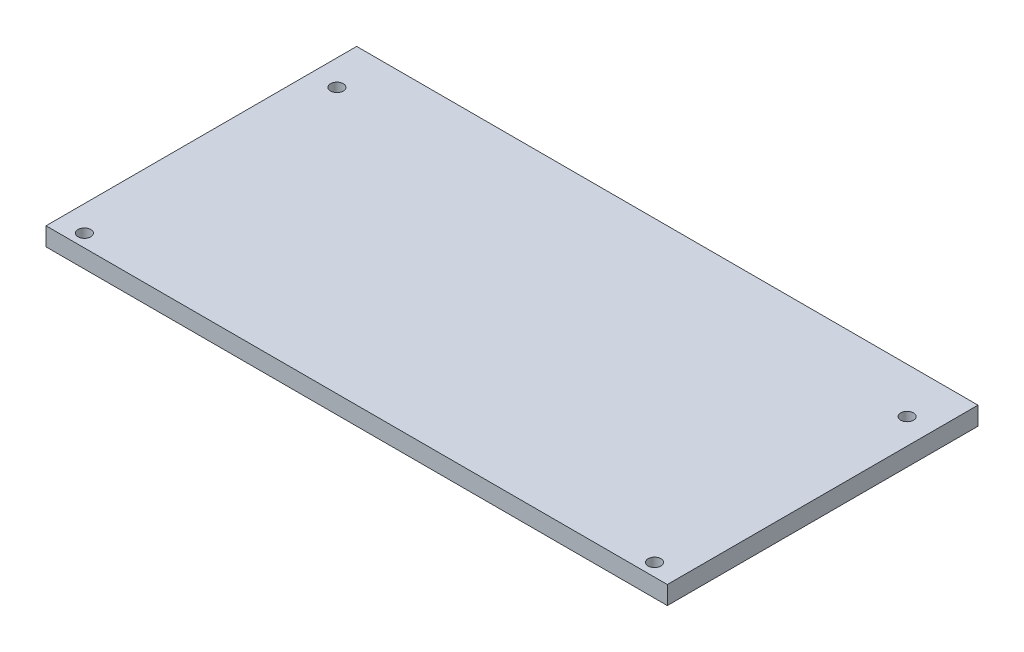
ISO-10303-21;
HEADER;
FILE_DESCRIPTION(('STEP AP214'),'2;1');
FILE_NAME('part.step','',(''),(''),'','','');
FILE_SCHEMA(('AUTOMOTIVE_DESIGN { 1 0 10303 214 1 1 1 1 }'));
ENDSEC;
DATA;
#1=APPLICATION_CONTEXT('core data for automotive mechanical design processes');
#2=APPLICATION_PROTOCOL_DEFINITION('international standard','automotive_design',2000,#1);
#3=PRODUCT_CONTEXT('',#1,'mechanical');
#4=PRODUCT('Part','Part','',(#3));
#5=PRODUCT_RELATED_PRODUCT_CATEGORY('part','',(#4));
#6=PRODUCT_DEFINITION_FORMATION('','',#4);
#7=PRODUCT_DEFINITION_CONTEXT('part definition',#1,'design');
#8=PRODUCT_DEFINITION('design','',#6,#7);
#9=PRODUCT_DEFINITION_SHAPE('','',#8);
#10=(LENGTH_UNIT() NAMED_UNIT(*) SI_UNIT(.MILLI.,.METRE.));
#11=(NAMED_UNIT(*) PLANE_ANGLE_UNIT() SI_UNIT($,.RADIAN.));
#12=(NAMED_UNIT(*) SI_UNIT($,.STERADIAN.) SOLID_ANGLE_UNIT());
#13=UNCERTAINTY_MEASURE_WITH_UNIT(LENGTH_MEASURE(1.E-05),#10,'distance_accuracy_value','');
#14=(GEOMETRIC_REPRESENTATION_CONTEXT(3) GLOBAL_UNCERTAINTY_ASSIGNED_CONTEXT((#13)) GLOBAL_UNIT_ASSIGNED_CONTEXT((#10,
#11,#12)) REPRESENTATION_CONTEXT('',''));
#15=CARTESIAN_POINT('',(0.,0.,0.));
#16=DIRECTION('',(0.,0.,1.));
#17=DIRECTION('',(1.,0.,0.));
#18=AXIS2_PLACEMENT_3D('',#15,#16,#17);
#19=CARTESIAN_POINT('',(-48.0628272251309,5.,-28.7041884816754));
#20=DIRECTION('',(1.,0.,0.));
#21=DIRECTION('',(0.,0.,-1.));
#22=AXIS2_PLACEMENT_3D('',#19,#20,#21);
#23=PLANE('',#22);
#24=DIRECTION('',(0.,0.,1.));
#25=VECTOR('',#24,1.);
#26=CARTESIAN_POINT('',(-48.0628272251309,0.,-28.7041884816754));
#27=LINE('',#26,#25);
#28=CARTESIAN_POINT('',(-48.0628272251309,0.,-28.7041884816754));
#29=VERTEX_POINT('',#28);
#30=CARTESIAN_POINT('',(-48.0628272251309,0.,56.2958115183246));
#31=VERTEX_POINT('',#30);
#32=EDGE_CURVE('E106',#29,#31,#27,.T.);
#33=ORIENTED_EDGE('',*,*,#32,.T.);
#34=DIRECTION('',(0.,-1.,0.));
#35=VECTOR('',#34,1.);
#36=CARTESIAN_POINT('',(-48.0628272251309,5.,56.2958115183246));
#37=LINE('',#36,#35);
#38=CARTESIAN_POINT('',(-48.0628272251309,5.,56.2958115183246));
#39=VERTEX_POINT('',#38);
#40=EDGE_CURVE('E11',#39,#31,#37,.T.);
#41=ORIENTED_EDGE('',*,*,#40,.F.);
#42=DIRECTION('',(0.,0.,1.));
#43=VECTOR('',#42,1.);
#44=CARTESIAN_POINT('',(-48.0628272251309,5.,-28.7041884816754));
#45=LINE('',#44,#43);
#46=CARTESIAN_POINT('',(-48.0628272251309,5.,-28.7041884816754));
#47=VERTEX_POINT('',#46);
#48=EDGE_CURVE('E90',#47,#39,#45,.T.);
#49=ORIENTED_EDGE('',*,*,#48,.F.);
#50=DIRECTION('',(0.,-1.,0.));
#51=VECTOR('',#50,1.);
#52=CARTESIAN_POINT('',(-48.0628272251309,5.,-28.7041884816754));
#53=LINE('',#52,#51);
#54=EDGE_CURVE('E102',#47,#29,#53,.T.);
#55=ORIENTED_EDGE('',*,*,#54,.T.);
#56=EDGE_LOOP('',(#33,#41,#49,#55));
#57=FACE_BOUND('',#56,.T.);
#58=ADVANCED_FACE('F38',(#57),#23,.F.);
#59=CARTESIAN_POINT('',(-48.0628272251309,5.,56.2958115183246));
#60=DIRECTION('',(0.,0.,-1.));
#61=DIRECTION('',(-1.,0.,0.));
#62=AXIS2_PLACEMENT_3D('',#59,#60,#61);
#63=PLANE('',#62);
#64=DIRECTION('',(1.,0.,0.));
#65=VECTOR('',#64,1.);
#66=CARTESIAN_POINT('',(-48.0628272251309,0.,56.2958115183246));
#67=LINE('',#66,#65);
#68=CARTESIAN_POINT('',(121.937172774869,0.,56.2958115183246));
#69=VERTEX_POINT('',#68);
#70=EDGE_CURVE('E95',#31,#69,#67,.T.);
#71=ORIENTED_EDGE('',*,*,#70,.T.);
#72=DIRECTION('',(0.,-1.,0.));
#73=VECTOR('',#72,1.);
#74=CARTESIAN_POINT('',(121.937172774869,5.,56.2958115183246));
#75=LINE('',#74,#73);
#76=CARTESIAN_POINT('',(121.937172774869,5.,56.2958115183246));
#77=VERTEX_POINT('',#76);
#78=EDGE_CURVE('E47',#77,#69,#75,.T.);
#79=ORIENTED_EDGE('',*,*,#78,.F.);
#80=DIRECTION('',(1.,0.,0.));
#81=VECTOR('',#80,1.);
#82=CARTESIAN_POINT('',(-48.0628272251309,5.,56.2958115183246));
#83=LINE('',#82,#81);
#84=EDGE_CURVE('E85',#39,#77,#83,.T.);
#85=ORIENTED_EDGE('',*,*,#84,.F.);
#86=ORIENTED_EDGE('',*,*,#40,.T.);
#87=EDGE_LOOP('',(#71,#79,#85,#86));
#88=FACE_BOUND('',#87,.T.);
#89=ADVANCED_FACE('F94',(#88),#63,.F.);
#90=CARTESIAN_POINT('',(121.937172774869,5.,-28.7041884816754));
#91=DIRECTION('',(-1.,0.,0.));
#92=DIRECTION('',(0.,0.,1.));
#93=AXIS2_PLACEMENT_3D('',#90,#91,#92);
#94=PLANE('',#93);
#95=DIRECTION('',(0.,0.,-1.));
#96=VECTOR('',#95,1.);
#97=CARTESIAN_POINT('',(121.937172774869,0.,-28.7041884816754));
#98=LINE('',#97,#96);
#99=CARTESIAN_POINT('',(121.937172774869,0.,-28.7041884816754));
#100=VERTEX_POINT('',#99);
#101=EDGE_CURVE('E72',#69,#100,#98,.T.);
#102=ORIENTED_EDGE('',*,*,#101,.T.);
#103=DIRECTION('',(0.,-1.,0.));
#104=VECTOR('',#103,1.);
#105=CARTESIAN_POINT('',(121.937172774869,5.,-28.7041884816754));
#106=LINE('',#105,#104);
#107=CARTESIAN_POINT('',(121.937172774869,5.,-28.7041884816754));
#108=VERTEX_POINT('',#107);
#109=EDGE_CURVE('E97',#108,#100,#106,.T.);
#110=ORIENTED_EDGE('',*,*,#109,.F.);
#111=DIRECTION('',(0.,0.,-1.));
#112=VECTOR('',#111,1.);
#113=CARTESIAN_POINT('',(121.937172774869,5.,-28.7041884816754));
#114=LINE('',#113,#112);
#115=EDGE_CURVE('E88',#77,#108,#114,.T.);
#116=ORIENTED_EDGE('',*,*,#115,.F.);
#117=ORIENTED_EDGE('',*,*,#78,.T.);
#118=EDGE_LOOP('',(#102,#110,#116,#117));
#119=FACE_BOUND('',#118,.T.);
#120=ADVANCED_FACE('F98',(#119),#94,.F.);
#121=CARTESIAN_POINT('',(-48.0628272251309,5.,-28.7041884816754));
#122=DIRECTION('',(0.,0.,1.));
#123=DIRECTION('',(1.,0.,0.));
#124=AXIS2_PLACEMENT_3D('',#121,#122,#123);
#125=PLANE('',#124);
#126=DIRECTION('',(-1.,0.,0.));
#127=VECTOR('',#126,1.);
#128=CARTESIAN_POINT('',(-48.0628272251309,0.,-28.7041884816754));
#129=LINE('',#128,#127);
#130=EDGE_CURVE('E78',#100,#29,#129,.T.);
#131=ORIENTED_EDGE('',*,*,#130,.T.);
#132=ORIENTED_EDGE('',*,*,#54,.F.);
#133=DIRECTION('',(-1.,0.,0.));
#134=VECTOR('',#133,1.);
#135=CARTESIAN_POINT('',(-48.0628272251309,5.,-28.7041884816754));
#136=LINE('',#135,#134);
#137=EDGE_CURVE('E55',#108,#47,#136,.T.);
#138=ORIENTED_EDGE('',*,*,#137,.F.);
#139=ORIENTED_EDGE('',*,*,#109,.T.);
#140=EDGE_LOOP('',(#131,#132,#138,#139));
#141=FACE_BOUND('',#140,.T.);
#142=ADVANCED_FACE('F120',(#141),#125,.F.);
#143=CARTESIAN_POINT('',(0.,5.,0.));
#144=DIRECTION('',(0.,1.,0.));
#145=DIRECTION('',(0.,0.,1.));
#146=AXIS2_PLACEMENT_3D('',#143,#144,#145);
#147=PLANE('',#146);
#148=CARTESIAN_POINT('',(114.937172774882,5.,52.7958115184465));
#149=DIRECTION('',(0.,-1.,0.));
#150=DIRECTION('',(0.,0.,-1.));
#151=AXIS2_PLACEMENT_3D('',#148,#149,#150);
#152=CIRCLE('',#151,1.74999999999998);
#153=CARTESIAN_POINT('',(114.937172774882,5.,51.0458115184465));
#154=VERTEX_POINT('',#153);
#155=EDGE_CURVE('E139',#154,#154,#152,.T.);
#156=ORIENTED_EDGE('',*,*,#155,.T.);
#157=EDGE_LOOP('',(#156));
#158=FACE_BOUND('',#157,.T.);
#159=CARTESIAN_POINT('',(114.937172774882,5.,-16.3003722342946));
#160=DIRECTION('',(0.,-1.,0.));
#161=DIRECTION('',(0.,0.,-1.));
#162=AXIS2_PLACEMENT_3D('',#159,#160,#161);
#163=CIRCLE('',#162,1.74999999999998);
#164=CARTESIAN_POINT('',(114.937172774882,5.,-18.0503722342946));
#165=VERTEX_POINT('',#164);
#166=EDGE_CURVE('E147',#165,#165,#163,.T.);
#167=ORIENTED_EDGE('',*,*,#166,.T.);
#168=EDGE_LOOP('',(#167));
#169=FACE_BOUND('',#168,.T.);
#170=CARTESIAN_POINT('',(-41.0628272251179,5.,-16.3003722342946));
#171=DIRECTION('',(0.,-1.,0.));
#172=DIRECTION('',(0.,0.,-1.));
#173=AXIS2_PLACEMENT_3D('',#170,#171,#172);
#174=CIRCLE('',#173,1.75);
#175=CARTESIAN_POINT('',(-41.0628272251179,5.,-18.0503722342946));
#176=VERTEX_POINT('',#175);
#177=EDGE_CURVE('E131',#176,#176,#174,.T.);
#178=ORIENTED_EDGE('',*,*,#177,.T.);
#179=EDGE_LOOP('',(#178));
#180=FACE_BOUND('',#179,.T.);
#181=CARTESIAN_POINT('',(-41.0628272251179,5.,52.7958115184466));
#182=DIRECTION('',(0.,-1.,0.));
#183=DIRECTION('',(0.,0.,-1.));
#184=AXIS2_PLACEMENT_3D('',#181,#182,#183);
#185=CIRCLE('',#184,1.75000000000006);
#186=CARTESIAN_POINT('',(-41.0628272251179,5.,51.0458115184465));
#187=VERTEX_POINT('',#186);
#188=EDGE_CURVE('E110',#187,#187,#185,.T.);
#189=ORIENTED_EDGE('',*,*,#188,.T.);
#190=EDGE_LOOP('',(#189));
#191=FACE_BOUND('',#190,.T.);
#192=ORIENTED_EDGE('',*,*,#48,.T.);
#193=ORIENTED_EDGE('',*,*,#84,.T.);
#194=ORIENTED_EDGE('',*,*,#115,.T.);
#195=ORIENTED_EDGE('',*,*,#137,.T.);
#196=EDGE_LOOP('',(#192,#193,#194,#195));
#197=FACE_BOUND('',#196,.T.);
#198=ADVANCED_FACE('F86',(#158,#169,#180,#191,#197),#147,.T.);
#199=CARTESIAN_POINT('',(0.,0.,0.));
#200=DIRECTION('',(0.,1.,0.));
#201=DIRECTION('',(0.,0.,1.));
#202=AXIS2_PLACEMENT_3D('',#199,#200,#201);
#203=PLANE('',#202);
#204=CARTESIAN_POINT('',(114.937172774882,0.,52.7958115184465));
#205=DIRECTION('',(0.,-1.,0.));
#206=DIRECTION('',(0.,0.,-1.));
#207=AXIS2_PLACEMENT_3D('',#204,#205,#206);
#208=CIRCLE('',#207,1.74999999999998);
#209=CARTESIAN_POINT('',(114.937172774882,0.,51.0458115184465));
#210=VERTEX_POINT('',#209);
#211=EDGE_CURVE('E135',#210,#210,#208,.T.);
#212=ORIENTED_EDGE('',*,*,#211,.F.);
#213=EDGE_LOOP('',(#212));
#214=FACE_BOUND('',#213,.T.);
#215=CARTESIAN_POINT('',(114.937172774882,0.,-16.3003722342946));
#216=DIRECTION('',(0.,-1.,0.));
#217=DIRECTION('',(0.,0.,-1.));
#218=AXIS2_PLACEMENT_3D('',#215,#216,#217);
#219=CIRCLE('',#218,1.74999999999998);
#220=CARTESIAN_POINT('',(114.937172774882,0.,-18.0503722342946));
#221=VERTEX_POINT('',#220);
#222=EDGE_CURVE('E143',#221,#221,#219,.T.);
#223=ORIENTED_EDGE('',*,*,#222,.F.);
#224=EDGE_LOOP('',(#223));
#225=FACE_BOUND('',#224,.T.);
#226=CARTESIAN_POINT('',(-41.0628272251179,0.,-16.3003722342946));
#227=DIRECTION('',(0.,-1.,0.));
#228=DIRECTION('',(0.,0.,-1.));
#229=AXIS2_PLACEMENT_3D('',#226,#227,#228);
#230=CIRCLE('',#229,1.75);
#231=CARTESIAN_POINT('',(-41.0628272251179,0.,-18.0503722342946));
#232=VERTEX_POINT('',#231);
#233=EDGE_CURVE('E151',#232,#232,#230,.T.);
#234=ORIENTED_EDGE('',*,*,#233,.F.);
#235=EDGE_LOOP('',(#234));
#236=FACE_BOUND('',#235,.T.);
#237=CARTESIAN_POINT('',(-41.0628272251179,0.,52.7958115184466));
#238=DIRECTION('',(0.,-1.,0.));
#239=DIRECTION('',(0.,0.,-1.));
#240=AXIS2_PLACEMENT_3D('',#237,#238,#239);
#241=CIRCLE('',#240,1.75000000000006);
#242=CARTESIAN_POINT('',(-41.0628272251179,0.,51.0458115184465));
#243=VERTEX_POINT('',#242);
#244=EDGE_CURVE('E127',#243,#243,#241,.T.);
#245=ORIENTED_EDGE('',*,*,#244,.F.);
#246=EDGE_LOOP('',(#245));
#247=FACE_BOUND('',#246,.T.);
#248=ORIENTED_EDGE('',*,*,#32,.F.);
#249=ORIENTED_EDGE('',*,*,#130,.F.);
#250=ORIENTED_EDGE('',*,*,#101,.F.);
#251=ORIENTED_EDGE('',*,*,#70,.F.);
#252=EDGE_LOOP('',(#248,#249,#250,#251));
#253=FACE_BOUND('',#252,.T.);
#254=ADVANCED_FACE('F123',(#214,#225,#236,#247,#253),#203,.F.);
#255=CARTESIAN_POINT('',(-41.0628272251179,5.,52.7958115184466));
#256=DIRECTION('',(0.,-1.,0.));
#257=DIRECTION('',(0.,0.,-1.));
#258=AXIS2_PLACEMENT_3D('',#255,#256,#257);
#259=CYLINDRICAL_SURFACE('',#258,1.75000000000006);
#260=ORIENTED_EDGE('',*,*,#188,.F.);
#261=EDGE_LOOP('',(#260));
#262=FACE_BOUND('',#261,.T.);
#263=ORIENTED_EDGE('',*,*,#244,.T.);
#264=EDGE_LOOP('',(#263));
#265=FACE_BOUND('',#264,.T.);
#266=ADVANCED_FACE('F165',(#262,#265),#259,.F.);
#267=CARTESIAN_POINT('',(-41.0628272251179,5.,-16.3003722342946));
#268=DIRECTION('',(0.,-1.,0.));
#269=DIRECTION('',(0.,0.,-1.));
#270=AXIS2_PLACEMENT_3D('',#267,#268,#269);
#271=CYLINDRICAL_SURFACE('',#270,1.75);
#272=ORIENTED_EDGE('',*,*,#177,.F.);
#273=EDGE_LOOP('',(#272));
#274=FACE_BOUND('',#273,.T.);
#275=ORIENTED_EDGE('',*,*,#233,.T.);
#276=EDGE_LOOP('',(#275));
#277=FACE_BOUND('',#276,.T.);
#278=ADVANCED_FACE('F161',(#274,#277),#271,.F.);
#279=CARTESIAN_POINT('',(114.937172774882,5.,-16.3003722342946));
#280=DIRECTION('',(0.,-1.,0.));
#281=DIRECTION('',(0.,0.,-1.));
#282=AXIS2_PLACEMENT_3D('',#279,#280,#281);
#283=CYLINDRICAL_SURFACE('',#282,1.74999999999998);
#284=ORIENTED_EDGE('',*,*,#166,.F.);
#285=EDGE_LOOP('',(#284));
#286=FACE_BOUND('',#285,.T.);
#287=ORIENTED_EDGE('',*,*,#222,.T.);
#288=EDGE_LOOP('',(#287));
#289=FACE_BOUND('',#288,.T.);
#290=ADVANCED_FACE('F164',(#286,#289),#283,.F.);
#291=CARTESIAN_POINT('',(114.937172774882,5.,52.7958115184465));
#292=DIRECTION('',(0.,-1.,0.));
#293=DIRECTION('',(0.,0.,-1.));
#294=AXIS2_PLACEMENT_3D('',#291,#292,#293);
#295=CYLINDRICAL_SURFACE('',#294,1.74999999999998);
#296=ORIENTED_EDGE('',*,*,#155,.F.);
#297=EDGE_LOOP('',(#296));
#298=FACE_BOUND('',#297,.T.);
#299=ORIENTED_EDGE('',*,*,#211,.T.);
#300=EDGE_LOOP('',(#299));
#301=FACE_BOUND('',#300,.T.);
#302=ADVANCED_FACE('F205',(#298,#301),#295,.F.);
#303=CLOSED_SHELL('',(#58,#89,#120,#142,#198,#254,#266,#278,#290,#302));
#304=MANIFOLD_SOLID_BREP('B2',#303);
#305=ADVANCED_BREP_SHAPE_REPRESENTATION('',(#18,#304),#14);
#306=SHAPE_DEFINITION_REPRESENTATION(#9,#305);
ENDSEC;
END-ISO-10303-21;
